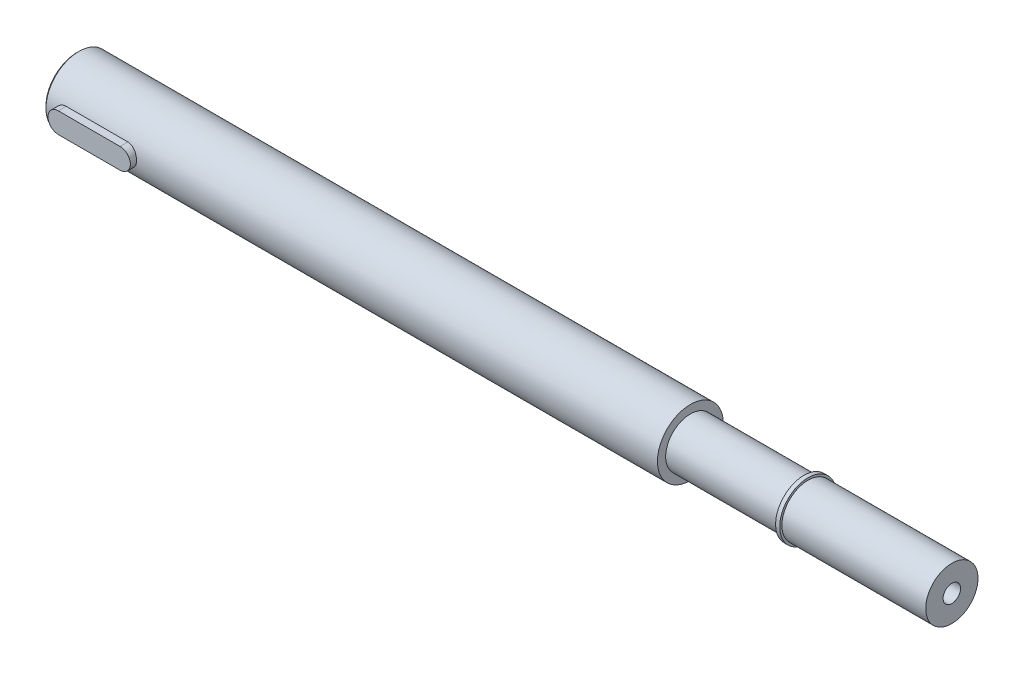
ISO-10303-21;
HEADER;
FILE_DESCRIPTION(('STEP AP214'),'2;1');
FILE_NAME('part.step','',(''),(''),'','','');
FILE_SCHEMA(('AUTOMOTIVE_DESIGN { 1 0 10303 214 1 1 1 1 }'));
ENDSEC;
DATA;
#1=APPLICATION_CONTEXT('core data for automotive mechanical design processes');
#2=APPLICATION_PROTOCOL_DEFINITION('international standard','automotive_design',2000,#1);
#3=PRODUCT_CONTEXT('',#1,'mechanical');
#4=PRODUCT('Part','Part','',(#3));
#5=PRODUCT_RELATED_PRODUCT_CATEGORY('part','',(#4));
#6=PRODUCT_DEFINITION_FORMATION('','',#4);
#7=PRODUCT_DEFINITION_CONTEXT('part definition',#1,'design');
#8=PRODUCT_DEFINITION('design','',#6,#7);
#9=PRODUCT_DEFINITION_SHAPE('','',#8);
#10=(LENGTH_UNIT() NAMED_UNIT(*) SI_UNIT(.MILLI.,.METRE.));
#11=(NAMED_UNIT(*) PLANE_ANGLE_UNIT() SI_UNIT($,.RADIAN.));
#12=(NAMED_UNIT(*) SI_UNIT($,.STERADIAN.) SOLID_ANGLE_UNIT());
#13=UNCERTAINTY_MEASURE_WITH_UNIT(LENGTH_MEASURE(1.E-05),#10,'distance_accuracy_value','');
#14=(GEOMETRIC_REPRESENTATION_CONTEXT(3) GLOBAL_UNCERTAINTY_ASSIGNED_CONTEXT((#13)) GLOBAL_UNIT_ASSIGNED_CONTEXT((#10,
#11,#12)) REPRESENTATION_CONTEXT('',''));
#15=CARTESIAN_POINT('',(0.,0.,0.));
#16=DIRECTION('',(0.,0.,1.));
#17=DIRECTION('',(1.,0.,0.));
#18=AXIS2_PLACEMENT_3D('',#15,#16,#17);
#19=CARTESIAN_POINT('',(-117.829393828516,0.,0.));
#20=DIRECTION('',(-1.,0.,0.));
#21=DIRECTION('',(0.,0.,1.));
#22=AXIS2_PLACEMENT_3D('',#19,#20,#21);
#23=PLANE('',#22);
#24=CARTESIAN_POINT('',(-117.829393828516,0.,0.));
#25=DIRECTION('',(1.,0.,0.));
#26=DIRECTION('',(0.,0.,-1.));
#27=AXIS2_PLACEMENT_3D('',#24,#25,#26);
#28=CIRCLE('',#27,15.);
#29=CARTESIAN_POINT('',(-117.829393828516,0.,-15.));
#30=VERTEX_POINT('',#29);
#31=EDGE_CURVE('E150',#30,#30,#28,.T.);
#32=ORIENTED_EDGE('',*,*,#31,.F.);
#33=EDGE_LOOP('',(#32));
#34=FACE_BOUND('',#33,.T.);
#35=ADVANCED_FACE('F49',(#34),#23,.T.);
#36=CARTESIAN_POINT('',(-116.829393828516,0.,0.));
#37=DIRECTION('',(1.,0.,0.));
#38=DIRECTION('',(0.,0.,-1.));
#39=AXIS2_PLACEMENT_3D('',#36,#37,#38);
#40=CONICAL_SURFACE('',#39,16.,0.785398163397448);
#41=ORIENTED_EDGE('',*,*,#31,.T.);
#42=EDGE_LOOP('',(#41));
#43=FACE_BOUND('',#42,.T.);
#44=CARTESIAN_POINT('',(-116.829393828516,0.,0.));
#45=DIRECTION('',(1.,0.,0.));
#46=DIRECTION('',(0.,0.,-1.));
#47=AXIS2_PLACEMENT_3D('',#44,#45,#46);
#48=CIRCLE('',#47,16.);
#49=CARTESIAN_POINT('',(-116.829393828516,0.,-16.));
#50=VERTEX_POINT('',#49);
#51=EDGE_CURVE('E147',#50,#50,#48,.T.);
#52=ORIENTED_EDGE('',*,*,#51,.F.);
#53=EDGE_LOOP('',(#52));
#54=FACE_BOUND('',#53,.T.);
#55=ADVANCED_FACE('F210',(#43,#54),#40,.T.);
#56=CARTESIAN_POINT('',(0.,0.,0.));
#57=DIRECTION('',(1.,0.,0.));
#58=DIRECTION('',(0.,0.,-1.));
#59=AXIS2_PLACEMENT_3D('',#56,#57,#58);
#60=CYLINDRICAL_SURFACE('',#59,16.);
#61=CARTESIAN_POINT('',(-107.829393828516,5.,15.1986841535706));
#62=CARTESIAN_POINT('',(-107.966323546254,5.00001876402018,15.1986635060155));
#63=CARTESIAN_POINT('',(-108.103245407126,4.99437589347759,15.2005339376472));
#64=CARTESIAN_POINT('',(-108.376037990197,4.9719066012981,15.2079058985265));
#65=CARTESIAN_POINT('',(-108.511908957747,4.95508287500206,15.2134065526431));
#66=CARTESIAN_POINT('',(-108.781269453846,4.91045141983464,15.2278686056186));
#67=CARTESIAN_POINT('',(-108.914764393775,4.88267328245064,15.2368206796073));
#68=CARTESIAN_POINT('',(-109.178806019882,4.81639022533697,15.2579029145887));
#69=CARTESIAN_POINT('',(-109.309352618297,4.77788498675236,15.2700331700498));
#70=CARTESIAN_POINT('',(-109.566532564116,4.69049837729811,15.2971014107057));
#71=CARTESIAN_POINT('',(-109.693168463467,4.64162394412445,15.3120375178334));
#72=CARTESIAN_POINT('',(-109.941816853966,4.5338788859812,15.3442856115609));
#73=CARTESIAN_POINT('',(-110.063827602359,4.47500453795589,15.3615984825888));
#74=CARTESIAN_POINT('',(-110.421782896496,4.28398711580932,15.4163884767029));
#75=CARTESIAN_POINT('',(-110.649785514306,4.13740351463561,15.4567319869187));
#76=CARTESIAN_POINT('',(-111.085345911299,3.80477014396879,15.5420083062615));
#77=CARTESIAN_POINT('',(-111.292052336792,3.61763914961478,15.5870445200358));
#78=CARTESIAN_POINT('',(-111.671761481205,3.21145982301368,15.6757673694125));
#79=CARTESIAN_POINT('',(-111.844758401239,2.99240601054464,15.7194537717275));
#80=CARTESIAN_POINT('',(-112.155844226338,2.52249761762139,15.8017432610086));
#81=CARTESIAN_POINT('',(-112.293054955312,2.27103576512449,15.8402090039263));
#82=CARTESIAN_POINT('',(-112.522900966694,1.74720631304676,15.9065031203034));
#83=CARTESIAN_POINT('',(-112.615548510063,1.47484448775402,15.9343344192537));
#84=CARTESIAN_POINT('',(-112.750797851523,0.925860089211052,15.9754868433124));
#85=CARTESIAN_POINT('',(-112.794855937554,0.649628435012777,15.989229278753));
#86=CARTESIAN_POINT('',(-112.836291259985,0.0933690149137215,16.0021438524195));
#87=CARTESIAN_POINT('',(-112.833678161097,-0.186657953048524,16.0013190072522));
#88=CARTESIAN_POINT('',(-112.782800352516,-0.73229958954638,15.9854845726588));
#89=CARTESIAN_POINT('',(-112.736115098304,-0.998078033880905,15.9709657627342));
#90=CARTESIAN_POINT('',(-112.601013511345,-1.51781473163231,15.9299791073477));
#91=CARTESIAN_POINT('',(-112.512594935035,-1.77177234876053,15.90351061948));
#92=CARTESIAN_POINT('',(-112.295510002358,-2.26431537219271,15.8409378140145));
#93=CARTESIAN_POINT('',(-112.166363865624,-2.50267435181536,15.8047194262738));
#94=CARTESIAN_POINT('',(-111.871917050207,-2.95480608942299,15.726470010495));
#95=CARTESIAN_POINT('',(-111.706607608972,-3.16857286940456,15.6844375745929));
#96=CARTESIAN_POINT('',(-111.336280160795,-3.57495597883695,15.5969449434458));
#97=CARTESIAN_POINT('',(-111.129896754145,-3.76632311133058,15.5514148920093));
#98=CARTESIAN_POINT('',(-110.798368201935,-4.0255398962626,15.4855747041344));
#99=CARTESIAN_POINT('',(-110.684113505844,-4.10735324144972,15.464023127535));
#100=CARTESIAN_POINT('',(-110.448955250337,-4.2611738972957,15.4223452821405));
#101=CARTESIAN_POINT('',(-110.32805431344,-4.33318503733556,15.4022184582275));
#102=CARTESIAN_POINT('',(-110.078860603153,-4.46768370741089,15.3637482945824));
#103=CARTESIAN_POINT('',(-109.950495810061,-4.53004475183006,15.3454296242414));
#104=CARTESIAN_POINT('',(-109.688657226685,-4.64365087484839,15.3114343470153));
#105=CARTESIAN_POINT('',(-109.55518556651,-4.69490052987992,15.2957566529907));
#106=CARTESIAN_POINT('',(-109.28418591036,-4.78581076137361,15.2675565411668));
#107=CARTESIAN_POINT('',(-109.146662402159,-4.82548366541209,15.2550307689955));
#108=CARTESIAN_POINT('',(-108.868512461932,-4.89292357731496,15.2335336556111));
#109=CARTESIAN_POINT('',(-108.727887486965,-4.92069605575214,15.2245606813372));
#110=CARTESIAN_POINT('',(-108.461080762214,-4.96155201839676,15.2112927618778));
#111=CARTESIAN_POINT('',(-108.335122509342,-4.97596872830392,15.2065749583153));
#112=CARTESIAN_POINT('',(-108.082577313372,-4.9951923004764,15.2002655216957));
#113=CARTESIAN_POINT('',(-107.955991512238,-5.00001273345967,15.1986694740171));
#114=CARTESIAN_POINT('',(-107.829393828516,-5.,15.1986841535706));
#115=B_SPLINE_CURVE_WITH_KNOTS('',3,(#61,#62,#63,#64,#65,#66,#67,#68,#69,#70,#71,#72,#73,#74,
#75,#76,#77,#78,#79,#80,#81,#82,#83,#84,#85,#86,#87,#88,#89,#90,#91,#92,#93,#94,#95,#96,#97,#98,
#99,#100,#101,#102,#103,#104,#105,#106,#107,#108,#109,#110,#111,#112,#113,#114),.UNSPECIFIED.,
.F.,.F.,(4,2,2,2,2,2,2,2,2,2,2,2,2,2,2,2,2,2,2,2,2,2,2,2,2,2,4),(0.,0.410647919758036,
0.821196881542661,1.23064432922751,1.64010394872541,2.04929047101912,2.45862967230993,
3.2768827913103,4.12046514534439,4.96419248897058,5.82700574327198,6.68958147010309,
7.52553600517321,8.36131743199138,9.16823951381225,9.97520498033131,10.7920560572179,
11.609105280929,12.4601312020614,12.8862315051731,13.3121648650028,13.7432787284905,
14.1742146909751,14.6046900798641,15.0349673682784,15.4151752920152,15.7948451560185),.UNSPECIFIED.);
#116=CARTESIAN_POINT('',(-107.829393828516,5.,15.1986841535706));
#117=VERTEX_POINT('',#116);
#118=CARTESIAN_POINT('',(-107.829393828516,-5.,15.1986841535706));
#119=VERTEX_POINT('',#118);
#120=EDGE_CURVE('E11',#117,#119,#115,.T.);
#121=ORIENTED_EDGE('',*,*,#120,.F.);
#122=DIRECTION('',(1.,0.,0.));
#123=VECTOR('',#122,1.);
#124=CARTESIAN_POINT('',(0.,5.,15.1986841535706));
#125=LINE('',#124,#123);
#126=CARTESIAN_POINT('',(-77.8293938285158,5.,15.1986841535706));
#127=VERTEX_POINT('',#126);
#128=EDGE_CURVE('E62',#127,#117,#125,.F.);
#129=ORIENTED_EDGE('',*,*,#128,.F.);
#130=CARTESIAN_POINT('',(-72.8293938285158,0.,16.));
#131=CARTESIAN_POINT('',(-72.8293956148661,0.273756740698179,15.9999986351195));
#132=CARTESIAN_POINT('',(-72.8519507362935,0.547532210011409,15.9929077993933));
#133=CARTESIAN_POINT('',(-72.9413387946728,1.08707683835382,15.9653157635526));
#134=CARTESIAN_POINT('',(-73.0081817539734,1.35284417090373,15.9448115279957));
#135=CARTESIAN_POINT('',(-73.1836713132986,1.86851417460313,15.892632627915));
#136=CARTESIAN_POINT('',(-73.2922532071271,2.11844070794284,15.860975259956));
#137=CARTESIAN_POINT('',(-73.5478630992296,2.59653920938622,15.7897587664487));
#138=CARTESIAN_POINT('',(-73.6948971556401,2.82470774178095,15.7501983960148));
#139=CARTESIAN_POINT('',(-74.0280177965832,3.25986133980768,15.6660085495921));
#140=CARTESIAN_POINT('',(-74.2150773687525,3.46608011262119,15.621268637007));
#141=CARTESIAN_POINT('',(-74.6208673981776,3.84478952815342,15.5324018550409));
#142=CARTESIAN_POINT('',(-74.8396037385223,4.01727389161514,15.4882751012093));
#143=CARTESIAN_POINT('',(-75.3091720837231,4.32777345930637,15.4044457876484));
#144=CARTESIAN_POINT('',(-75.5606637385235,4.46483136593109,15.364879531022));
#145=CARTESIAN_POINT('',(-76.0845630883384,4.69438964299238,15.2963120709365));
#146=CARTESIAN_POINT('',(-76.3569652516592,4.78690175085853,15.2673080849026));
#147=CARTESIAN_POINT('',(-76.9063061383495,4.92193839721856,15.224304279618));
#148=CARTESIAN_POINT('',(-77.182861203084,4.96588440031618,15.2098789171452));
#149=CARTESIAN_POINT('',(-77.7397663041506,5.00698220147793,15.1964022056731));
#150=CARTESIAN_POINT('',(-78.0201153117768,5.00414643984172,15.1973467694716));
#151=CARTESIAN_POINT('',(-78.5648916696269,4.95287298929817,15.2141275626545));
#152=CARTESIAN_POINT('',(-78.8295103320677,4.90624231472934,15.2293736684469));
#153=CARTESIAN_POINT('',(-79.3469624547648,4.77163253417961,15.272081024701));
#154=CARTESIAN_POINT('',(-79.5997946593741,4.68364903377187,15.2995435733467));
#155=CARTESIAN_POINT('',(-80.0908016062142,4.46755498726522,15.3640417609541));
#156=CARTESIAN_POINT('',(-80.3287082712751,4.33887702648707,15.4012113865356));
#157=CARTESIAN_POINT('',(-80.7801449000409,4.04544082951014,15.4808742631002));
#158=CARTESIAN_POINT('',(-80.993668509533,3.88067322086206,15.523368895754));
#159=CARTESIAN_POINT('',(-81.4004936021813,3.51086781672958,15.6112611120491));
#160=CARTESIAN_POINT('',(-81.5924320596339,3.30433828237156,15.6567027842357));
#161=CARTESIAN_POINT('',(-81.9392814028352,2.86145763238184,15.7436628303753));
#162=CARTESIAN_POINT('',(-82.0941895453928,2.62510430939601,15.7851809135328));
#163=CARTESIAN_POINT('',(-82.3635045829207,2.12665844186189,15.8600517956098));
#164=CARTESIAN_POINT('',(-82.4775863703716,1.86437962767714,15.8933384259289));
#165=CARTESIAN_POINT('',(-82.6596058319221,1.32307191113055,15.9475182331416));
#166=CARTESIAN_POINT('',(-82.7275575174694,1.04404812289842,15.9684151730059));
#167=CARTESIAN_POINT('',(-82.8130659988317,0.48874062916138,15.9948555758007));
#168=CARTESIAN_POINT('',(-82.8324680028899,0.212767395155368,16.0009609158175));
#169=CARTESIAN_POINT('',(-82.8255289219665,-0.338521222930349,15.9987919892393));
#170=CARTESIAN_POINT('',(-82.7991945192253,-0.613836697226039,15.9905198232454));
#171=CARTESIAN_POINT('',(-82.7030114580902,-1.1488773319034,15.9608945507905));
#172=CARTESIAN_POINT('',(-82.6342607580658,-1.40881991368375,15.9398717244275));
#173=CARTESIAN_POINT('',(-82.4565364190489,-1.91340771544551,15.8872048551716));
#174=CARTESIAN_POINT('',(-82.3475578124157,-2.15805104179623,15.8555595005737));
#175=CARTESIAN_POINT('',(-82.089500962321,-2.63172962668875,15.783941710377));
#176=CARTESIAN_POINT('',(-81.9395098785285,-2.86023895915116,15.7437850727067));
#177=CARTESIAN_POINT('',(-81.6047809880461,-3.28946340384104,15.6597364001372));
#178=CARTESIAN_POINT('',(-81.4200337575372,-3.4901709521758,15.6158433539155));
#179=CARTESIAN_POINT('',(-81.0123582683074,-3.86634985167608,15.5270797953256));
#180=CARTESIAN_POINT('',(-80.7882071735589,-4.04050609358125,15.4822394682576));
#181=CARTESIAN_POINT('',(-80.3128873630087,-4.34885000980606,15.3984778838242));
#182=CARTESIAN_POINT('',(-80.0617190764078,-4.48303831893718,15.3595565324524));
#183=CARTESIAN_POINT('',(-79.5400131370339,-4.70680333922169,15.2924712932347));
#184=CARTESIAN_POINT('',(-79.2695552307729,-4.7965527822405,15.264265854275));
#185=CARTESIAN_POINT('',(-78.7163038555213,-4.92891577272361,15.2220468337724));
#186=CARTESIAN_POINT('',(-78.4335151231417,-4.97154725655978,15.2080278520491));
#187=CARTESIAN_POINT('',(-77.8773774781941,-5.00717624632502,15.1963317085551));
#188=CARTESIAN_POINT('',(-77.6041800131261,-5.00233118486543,15.1979441840057));
#189=CARTESIAN_POINT('',(-77.062695488748,-4.94835272515335,15.2156036150361));
#190=CARTESIAN_POINT('',(-76.7944082009688,-4.89922139290049,15.2316498972641));
#191=CARTESIAN_POINT('',(-76.2742176701482,-4.7595091965447,15.2758725673356));
#192=CARTESIAN_POINT('',(-76.0221320641423,-4.66954569624032,15.3038679276103));
#193=CARTESIAN_POINT('',(-75.5364321743797,-4.45120909339997,15.3687881701825));
#194=CARTESIAN_POINT('',(-75.3028216602022,-4.32282817776947,15.4057148685868));
#195=CARTESIAN_POINT('',(-74.8508099467565,-4.02542700053973,15.4861394813401));
#196=CARTESIAN_POINT('',(-74.6333613105148,-3.85501334096529,15.5298379569183));
#197=CARTESIAN_POINT('',(-74.2294485160678,-3.4808359856192,15.6179599528484));
#198=CARTESIAN_POINT('',(-74.0429926725515,-3.27706336937756,15.6623836642662));
#199=CARTESIAN_POINT('',(-73.7002636750641,-2.83394665129339,15.7486908780989));
#200=CARTESIAN_POINT('',(-73.545174882716,-2.59365829794954,15.7904440692269));
#201=CARTESIAN_POINT('',(-73.277798167958,-2.0891165520546,15.8650707718751));
#202=CARTESIAN_POINT('',(-73.1654934199484,-1.82487263118179,15.8979477726329));
#203=CARTESIAN_POINT('',(-72.9950283580819,-1.30299054149591,15.9488260293388));
#204=CARTESIAN_POINT('',(-72.9330943592944,-1.04668134845018,15.9678496322456));
#205=CARTESIAN_POINT('',(-72.8502803886449,-0.526919581760985,15.9934360136194));
#206=CARTESIAN_POINT('',(-72.8293921092998,-0.26346846455869,16.0000013135858));
#207=CARTESIAN_POINT('',(-72.8293938285158,0.,16.));
#208=B_SPLINE_CURVE_WITH_KNOTS('',3,(#130,#131,#132,#133,#134,#135,#136,#137,#138,#139,#140,
#141,#142,#143,#144,#145,#146,#147,#148,#149,#150,#151,#152,#153,#154,#155,#156,#157,#158,#159,
#160,#161,#162,#163,#164,#165,#166,#167,#168,#169,#170,#171,#172,#173,#174,#175,#176,#177,#178,
#179,#180,#181,#182,#183,#184,#185,#186,#187,#188,#189,#190,#191,#192,#193,#194,#195,#196,#197,
#198,#199,#200,#201,#202,#203,#204,#205,#206,#207),.UNSPECIFIED.,.T.,.F.,(4,2,2,2,2,2,2,2,2,2,2,
2,2,2,2,2,2,2,2,2,2,2,2,2,2,2,2,2,2,2,2,2,2,2,2,2,2,2,4),(0.,0.82030179773004,1.64078929339627,
2.46000991680975,3.27935968623356,4.12151288780633,4.96382269725104,5.82695084991452,
6.68985145121464,7.52676600672193,8.36345801183909,9.16707669695194,9.97078079925601,
10.7862257089153,11.6018826405078,12.4546698912775,13.3075202966256,14.1670184276843,
15.0262553798757,15.852302742023,16.678229426068,17.4836250690084,18.2891202014735,
19.1142529896272,19.9396098284639,20.7976711486191,21.655718839442,22.5104046302277,
23.3647649559871,24.1804881394266,24.9961732705188,25.7999165363423,26.6038233736824,
27.4391805607299,28.274761495409,29.1376267255319,30.0001522671289,30.789785466537,
31.5792588309973),.UNSPECIFIED.);
#209=CARTESIAN_POINT('',(-77.8293938285158,-5.,15.1986841535706));
#210=VERTEX_POINT('',#209);
#211=EDGE_CURVE('E156',#210,#127,#208,.T.);
#212=ORIENTED_EDGE('',*,*,#211,.F.);
#213=DIRECTION('',(1.,0.,0.));
#214=VECTOR('',#213,1.);
#215=CARTESIAN_POINT('',(0.,-5.,15.1986841535706));
#216=LINE('',#215,#214);
#217=EDGE_CURVE('E153',#119,#210,#216,.T.);
#218=ORIENTED_EDGE('',*,*,#217,.F.);
#219=EDGE_LOOP('',(#121,#129,#212,#218));
#220=FACE_BOUND('',#219,.T.);
#221=ORIENTED_EDGE('',*,*,#51,.T.);
#222=EDGE_LOOP('',(#221));
#223=FACE_BOUND('',#222,.T.);
#224=CARTESIAN_POINT('',(180.170606171484,0.,0.));
#225=DIRECTION('',(1.,0.,0.));
#226=DIRECTION('',(0.,0.,-1.));
#227=AXIS2_PLACEMENT_3D('',#224,#225,#226);
#228=CIRCLE('',#227,16.);
#229=CARTESIAN_POINT('',(180.170606171484,0.,-16.));
#230=VERTEX_POINT('',#229);
#231=EDGE_CURVE('E144',#230,#230,#228,.T.);
#232=ORIENTED_EDGE('',*,*,#231,.F.);
#233=EDGE_LOOP('',(#232));
#234=FACE_BOUND('',#233,.T.);
#235=ADVANCED_FACE('F161',(#220,#223,#234),#60,.T.);
#236=CARTESIAN_POINT('',(180.170606171484,16.,0.));
#237=DIRECTION('',(1.,0.,0.));
#238=DIRECTION('',(0.,0.,-1.));
#239=AXIS2_PLACEMENT_3D('',#236,#237,#238);
#240=PLANE('',#239);
#241=ORIENTED_EDGE('',*,*,#231,.T.);
#242=EDGE_LOOP('',(#241));
#243=FACE_BOUND('',#242,.T.);
#244=CARTESIAN_POINT('',(180.170606171484,0.,0.));
#245=DIRECTION('',(1.,0.,0.));
#246=DIRECTION('',(0.,0.,-1.));
#247=AXIS2_PLACEMENT_3D('',#244,#245,#246);
#248=CIRCLE('',#247,12.);
#249=CARTESIAN_POINT('',(180.170606171484,0.,-12.));
#250=VERTEX_POINT('',#249);
#251=EDGE_CURVE('E141',#250,#250,#248,.T.);
#252=ORIENTED_EDGE('',*,*,#251,.F.);
#253=EDGE_LOOP('',(#252));
#254=FACE_BOUND('',#253,.T.);
#255=ADVANCED_FACE('F202',(#243,#254),#240,.T.);
#256=CARTESIAN_POINT('',(0.,0.,0.));
#257=DIRECTION('',(1.,0.,0.));
#258=DIRECTION('',(0.,0.,-1.));
#259=AXIS2_PLACEMENT_3D('',#256,#257,#258);
#260=CYLINDRICAL_SURFACE('',#259,12.);
#261=ORIENTED_EDGE('',*,*,#251,.T.);
#262=EDGE_LOOP('',(#261));
#263=FACE_BOUND('',#262,.T.);
#264=CARTESIAN_POINT('',(235.320606171484,0.,0.));
#265=DIRECTION('',(1.,0.,0.));
#266=DIRECTION('',(0.,0.,-1.));
#267=AXIS2_PLACEMENT_3D('',#264,#265,#266);
#268=CIRCLE('',#267,12.);
#269=CARTESIAN_POINT('',(235.320606171484,0.,-12.));
#270=VERTEX_POINT('',#269);
#271=EDGE_CURVE('E138',#270,#270,#268,.T.);
#272=ORIENTED_EDGE('',*,*,#271,.F.);
#273=EDGE_LOOP('',(#272));
#274=FACE_BOUND('',#273,.T.);
#275=ADVANCED_FACE('F199',(#263,#274),#260,.T.);
#276=CARTESIAN_POINT('',(235.320606171484,13.7577044495915,0.));
#277=DIRECTION('',(-1.,0.,0.));
#278=DIRECTION('',(0.,0.,1.));
#279=AXIS2_PLACEMENT_3D('',#276,#277,#278);
#280=PLANE('',#279);
#281=ORIENTED_EDGE('',*,*,#271,.T.);
#282=EDGE_LOOP('',(#281));
#283=FACE_BOUND('',#282,.T.);
#284=CARTESIAN_POINT('',(235.320606171484,0.,0.));
#285=DIRECTION('',(1.,0.,0.));
#286=DIRECTION('',(0.,0.,-1.));
#287=AXIS2_PLACEMENT_3D('',#284,#285,#286);
#288=CIRCLE('',#287,13.7577044495915);
#289=CARTESIAN_POINT('',(235.320606171484,0.,-13.7577044495915));
#290=VERTEX_POINT('',#289);
#291=EDGE_CURVE('E135',#290,#290,#288,.T.);
#292=ORIENTED_EDGE('',*,*,#291,.F.);
#293=EDGE_LOOP('',(#292));
#294=FACE_BOUND('',#293,.T.);
#295=ADVANCED_FACE('F195',(#283,#294),#280,.T.);
#296=CARTESIAN_POINT('',(0.,0.,0.));
#297=DIRECTION('',(1.,0.,0.));
#298=DIRECTION('',(0.,0.,-1.));
#299=AXIS2_PLACEMENT_3D('',#296,#297,#298);
#300=CYLINDRICAL_SURFACE('',#299,13.7577044495915);
#301=ORIENTED_EDGE('',*,*,#291,.T.);
#302=EDGE_LOOP('',(#301));
#303=FACE_BOUND('',#302,.T.);
#304=CARTESIAN_POINT('',(237.320606171484,0.,0.));
#305=DIRECTION('',(1.,0.,0.));
#306=DIRECTION('',(0.,0.,-1.));
#307=AXIS2_PLACEMENT_3D('',#304,#305,#306);
#308=CIRCLE('',#307,13.7577044495915);
#309=CARTESIAN_POINT('',(237.320606171484,0.,-13.7577044495915));
#310=VERTEX_POINT('',#309);
#311=EDGE_CURVE('E132',#310,#310,#308,.T.);
#312=ORIENTED_EDGE('',*,*,#311,.F.);
#313=EDGE_LOOP('',(#312));
#314=FACE_BOUND('',#313,.T.);
#315=ADVANCED_FACE('F191',(#303,#314),#300,.T.);
#316=CARTESIAN_POINT('',(237.320606171484,12.7,0.));
#317=DIRECTION('',(1.,0.,0.));
#318=DIRECTION('',(0.,0.,-1.));
#319=AXIS2_PLACEMENT_3D('',#316,#317,#318);
#320=PLANE('',#319);
#321=ORIENTED_EDGE('',*,*,#311,.T.);
#322=EDGE_LOOP('',(#321));
#323=FACE_BOUND('',#322,.T.);
#324=CARTESIAN_POINT('',(237.320606171484,0.,0.));
#325=DIRECTION('',(1.,0.,0.));
#326=DIRECTION('',(0.,0.,-1.));
#327=AXIS2_PLACEMENT_3D('',#324,#325,#326);
#328=CIRCLE('',#327,12.7);
#329=CARTESIAN_POINT('',(237.320606171484,0.,-12.7));
#330=VERTEX_POINT('',#329);
#331=EDGE_CURVE('E129',#330,#330,#328,.T.);
#332=ORIENTED_EDGE('',*,*,#331,.F.);
#333=EDGE_LOOP('',(#332));
#334=FACE_BOUND('',#333,.T.);
#335=ADVANCED_FACE('F187',(#323,#334),#320,.T.);
#336=CARTESIAN_POINT('',(0.,0.,0.));
#337=DIRECTION('',(1.,0.,0.));
#338=DIRECTION('',(0.,0.,-1.));
#339=AXIS2_PLACEMENT_3D('',#336,#337,#338);
#340=CYLINDRICAL_SURFACE('',#339,12.7);
#341=ORIENTED_EDGE('',*,*,#331,.T.);
#342=EDGE_LOOP('',(#341));
#343=FACE_BOUND('',#342,.T.);
#344=CARTESIAN_POINT('',(307.170606171484,0.,0.));
#345=DIRECTION('',(1.,0.,0.));
#346=DIRECTION('',(0.,0.,-1.));
#347=AXIS2_PLACEMENT_3D('',#344,#345,#346);
#348=CIRCLE('',#347,12.7);
#349=CARTESIAN_POINT('',(307.170606171484,0.,-12.7));
#350=VERTEX_POINT('',#349);
#351=EDGE_CURVE('E121',#350,#350,#348,.T.);
#352=ORIENTED_EDGE('',*,*,#351,.F.);
#353=EDGE_LOOP('',(#352));
#354=FACE_BOUND('',#353,.T.);
#355=ADVANCED_FACE('F183',(#343,#354),#340,.T.);
#356=CARTESIAN_POINT('',(307.170606171484,12.7,0.));
#357=DIRECTION('',(1.,0.,0.));
#358=DIRECTION('',(0.,0.,-1.));
#359=AXIS2_PLACEMENT_3D('',#356,#357,#358);
#360=PLANE('',#359);
#361=CARTESIAN_POINT('',(307.170606171484,0.,0.));
#362=DIRECTION('',(1.,0.,0.));
#363=DIRECTION('',(0.,0.,-1.));
#364=AXIS2_PLACEMENT_3D('',#361,#362,#363);
#365=CIRCLE('',#364,4.24999999999999);
#366=CARTESIAN_POINT('',(307.170606171484,0.,-4.24999999999999));
#367=VERTEX_POINT('',#366);
#368=EDGE_CURVE('E102',#367,#367,#365,.T.);
#369=ORIENTED_EDGE('',*,*,#368,.F.);
#370=EDGE_LOOP('',(#369));
#371=FACE_BOUND('',#370,.T.);
#372=ORIENTED_EDGE('',*,*,#351,.T.);
#373=EDGE_LOOP('',(#372));
#374=FACE_BOUND('',#373,.T.);
#375=ADVANCED_FACE('F179',(#371,#374),#360,.T.);
#376=CARTESIAN_POINT('',(-107.829393828516,0.,9.));
#377=DIRECTION('',(0.,0.,1.));
#378=DIRECTION('',(1.,0.,0.));
#379=AXIS2_PLACEMENT_3D('',#376,#377,#378);
#380=CYLINDRICAL_SURFACE('',#379,5.);
#381=DIRECTION('',(0.,0.,1.));
#382=VECTOR('',#381,1.);
#383=CARTESIAN_POINT('',(-107.829393828516,5.,9.));
#384=LINE('',#383,#382);
#385=CARTESIAN_POINT('',(-107.829393828516,5.,19.));
#386=VERTEX_POINT('',#385);
#387=EDGE_CURVE('E119',#117,#386,#384,.T.);
#388=ORIENTED_EDGE('',*,*,#387,.F.);
#389=ORIENTED_EDGE('',*,*,#120,.T.);
#390=DIRECTION('',(0.,0.,1.));
#391=VECTOR('',#390,1.);
#392=CARTESIAN_POINT('',(-107.829393828516,-5.,9.));
#393=LINE('',#392,#391);
#394=CARTESIAN_POINT('',(-107.829393828516,-5.,19.));
#395=VERTEX_POINT('',#394);
#396=EDGE_CURVE('E118',#119,#395,#393,.T.);
#397=ORIENTED_EDGE('',*,*,#396,.T.);
#398=CARTESIAN_POINT('',(-107.829393828516,0.,19.));
#399=DIRECTION('',(0.,0.,1.));
#400=DIRECTION('',(1.,0.,0.));
#401=AXIS2_PLACEMENT_3D('',#398,#399,#400);
#402=CIRCLE('',#401,5.);
#403=EDGE_CURVE('E101',#386,#395,#402,.T.);
#404=ORIENTED_EDGE('',*,*,#403,.F.);
#405=EDGE_LOOP('',(#388,#389,#397,#404));
#406=FACE_BOUND('',#405,.T.);
#407=ADVANCED_FACE('F175',(#406),#380,.T.);
#408=CARTESIAN_POINT('',(-107.829393828516,5.,9.));
#409=DIRECTION('',(0.,1.,0.));
#410=DIRECTION('',(0.,0.,1.));
#411=AXIS2_PLACEMENT_3D('',#408,#409,#410);
#412=PLANE('',#411);
#413=DIRECTION('',(0.,0.,1.));
#414=VECTOR('',#413,1.);
#415=CARTESIAN_POINT('',(-77.8293938285158,5.,9.));
#416=LINE('',#415,#414);
#417=CARTESIAN_POINT('',(-77.8293938285158,5.,19.));
#418=VERTEX_POINT('',#417);
#419=EDGE_CURVE('E122',#127,#418,#416,.T.);
#420=ORIENTED_EDGE('',*,*,#419,.F.);
#421=ORIENTED_EDGE('',*,*,#128,.T.);
#422=ORIENTED_EDGE('',*,*,#387,.T.);
#423=DIRECTION('',(-1.,0.,0.));
#424=VECTOR('',#423,1.);
#425=CARTESIAN_POINT('',(-107.829393828516,5.,19.));
#426=LINE('',#425,#424);
#427=EDGE_CURVE('E115',#418,#386,#426,.T.);
#428=ORIENTED_EDGE('',*,*,#427,.F.);
#429=EDGE_LOOP('',(#420,#421,#422,#428));
#430=FACE_BOUND('',#429,.T.);
#431=ADVANCED_FACE('F170',(#430),#412,.T.);
#432=CARTESIAN_POINT('',(-77.8293938285158,0.,9.));
#433=DIRECTION('',(0.,0.,1.));
#434=DIRECTION('',(1.,0.,0.));
#435=AXIS2_PLACEMENT_3D('',#432,#433,#434);
#436=CYLINDRICAL_SURFACE('',#435,5.);
#437=DIRECTION('',(0.,0.,1.));
#438=VECTOR('',#437,1.);
#439=CARTESIAN_POINT('',(-77.8293938285158,-5.,9.));
#440=LINE('',#439,#438);
#441=CARTESIAN_POINT('',(-77.8293938285158,-5.,19.));
#442=VERTEX_POINT('',#441);
#443=EDGE_CURVE('E124',#210,#442,#440,.T.);
#444=ORIENTED_EDGE('',*,*,#443,.F.);
#445=ORIENTED_EDGE('',*,*,#211,.T.);
#446=ORIENTED_EDGE('',*,*,#419,.T.);
#447=CARTESIAN_POINT('',(-77.8293938285158,0.,19.));
#448=DIRECTION('',(0.,0.,1.));
#449=DIRECTION('',(1.,0.,0.));
#450=AXIS2_PLACEMENT_3D('',#447,#448,#449);
#451=CIRCLE('',#450,5.);
#452=EDGE_CURVE('E112',#442,#418,#451,.T.);
#453=ORIENTED_EDGE('',*,*,#452,.F.);
#454=EDGE_LOOP('',(#444,#445,#446,#453));
#455=FACE_BOUND('',#454,.T.);
#456=ADVANCED_FACE('F164',(#455),#436,.T.);
#457=CARTESIAN_POINT('',(-107.829393828516,-5.,9.));
#458=DIRECTION('',(0.,-1.,0.));
#459=DIRECTION('',(0.,0.,-1.));
#460=AXIS2_PLACEMENT_3D('',#457,#458,#459);
#461=PLANE('',#460);
#462=ORIENTED_EDGE('',*,*,#396,.F.);
#463=ORIENTED_EDGE('',*,*,#217,.T.);
#464=ORIENTED_EDGE('',*,*,#443,.T.);
#465=DIRECTION('',(1.,0.,0.));
#466=VECTOR('',#465,1.);
#467=CARTESIAN_POINT('',(-107.829393828516,-5.,19.));
#468=LINE('',#467,#466);
#469=EDGE_CURVE('E105',#395,#442,#468,.T.);
#470=ORIENTED_EDGE('',*,*,#469,.F.);
#471=EDGE_LOOP('',(#462,#463,#464,#470));
#472=FACE_BOUND('',#471,.T.);
#473=ADVANCED_FACE('F169',(#472),#461,.T.);
#474=CARTESIAN_POINT('',(-107.829393828516,0.,19.));
#475=DIRECTION('',(0.,0.,1.));
#476=DIRECTION('',(1.,0.,0.));
#477=AXIS2_PLACEMENT_3D('',#474,#475,#476);
#478=PLANE('',#477);
#479=ORIENTED_EDGE('',*,*,#403,.T.);
#480=ORIENTED_EDGE('',*,*,#469,.T.);
#481=ORIENTED_EDGE('',*,*,#452,.T.);
#482=ORIENTED_EDGE('',*,*,#427,.T.);
#483=EDGE_LOOP('',(#479,#480,#481,#482));
#484=FACE_BOUND('',#483,.T.);
#485=ADVANCED_FACE('F95',(#484),#478,.T.);
#486=CARTESIAN_POINT('',(282.670606171484,0.,0.));
#487=DIRECTION('',(1.,0.,0.));
#488=DIRECTION('',(0.,0.,-1.));
#489=AXIS2_PLACEMENT_3D('',#486,#487,#488);
#490=CONICAL_SURFACE('',#489,4.24999999999999,1.02974425867665);
#491=CARTESIAN_POINT('',(280.116948540617,0.,0.));
#492=VERTEX_POINT('',#491);
#493=VERTEX_LOOP('',#492);
#494=FACE_BOUND('',#493,.T.);
#495=CARTESIAN_POINT('',(282.670606171484,0.,0.));
#496=DIRECTION('',(1.,0.,0.));
#497=DIRECTION('',(0.,0.,-1.));
#498=AXIS2_PLACEMENT_3D('',#495,#496,#497);
#499=CIRCLE('',#498,4.24999999999999);
#500=CARTESIAN_POINT('',(282.670606171484,0.,-4.24999999999999));
#501=VERTEX_POINT('',#500);
#502=EDGE_CURVE('E99',#501,#501,#499,.T.);
#503=ORIENTED_EDGE('',*,*,#502,.T.);
#504=EDGE_LOOP('',(#503));
#505=FACE_BOUND('',#504,.T.);
#506=ADVANCED_FACE('F91',(#494,#505),#490,.F.);
#507=CARTESIAN_POINT('',(307.170606171484,0.,0.));
#508=DIRECTION('',(1.,0.,0.));
#509=DIRECTION('',(0.,0.,-1.));
#510=AXIS2_PLACEMENT_3D('',#507,#508,#509);
#511=CYLINDRICAL_SURFACE('',#510,4.24999999999999);
#512=ORIENTED_EDGE('',*,*,#502,.F.);
#513=EDGE_LOOP('',(#512));
#514=FACE_BOUND('',#513,.T.);
#515=ORIENTED_EDGE('',*,*,#368,.T.);
#516=EDGE_LOOP('',(#515));
#517=FACE_BOUND('',#516,.T.);
#518=ADVANCED_FACE('F94',(#514,#517),#511,.F.);
#519=CLOSED_SHELL('',(#35,#55,#235,#255,#275,#295,#315,#335,#355,#375,#407,#431,#456,#473,#485,
#506,#518));
#520=MANIFOLD_SOLID_BREP('B2',#519);
#521=ADVANCED_BREP_SHAPE_REPRESENTATION('',(#18,#520),#14);
#522=SHAPE_DEFINITION_REPRESENTATION(#9,#521);
ENDSEC;
END-ISO-10303-21;
